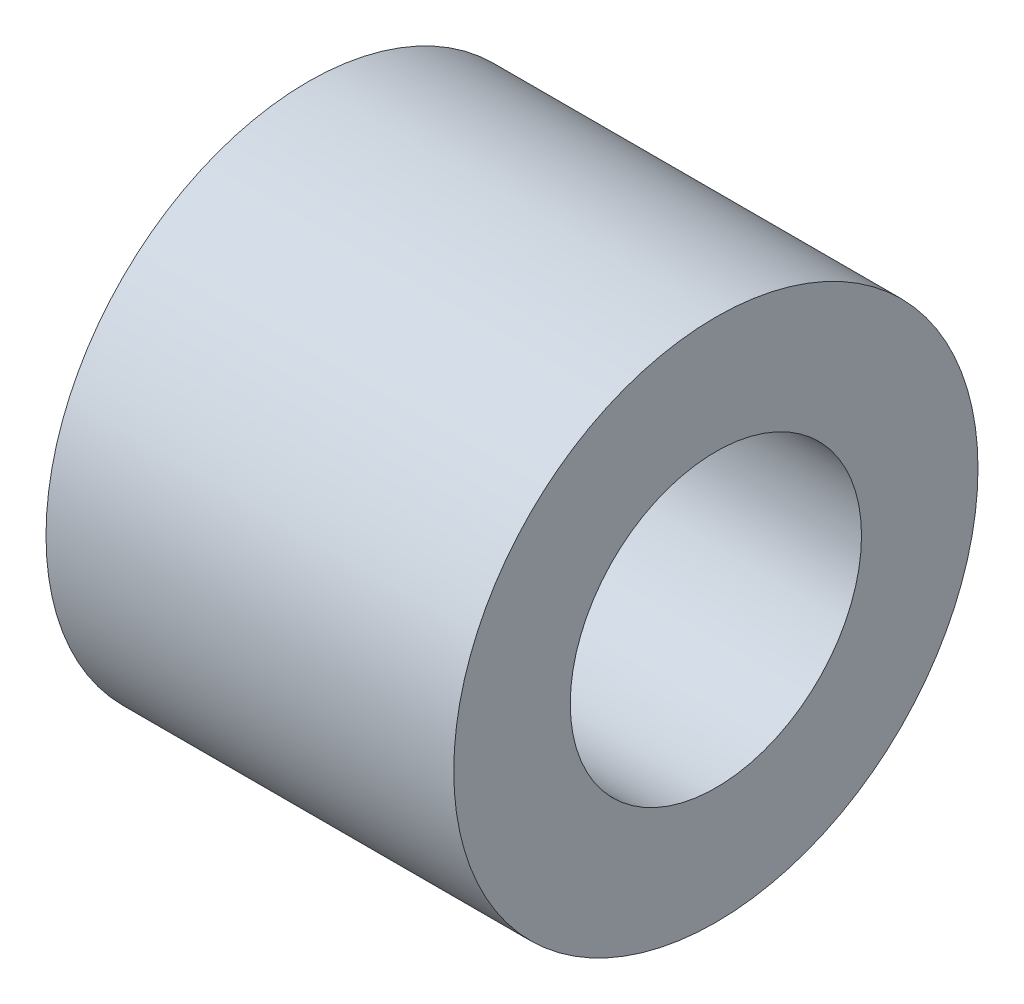
ISO-10303-21;
HEADER;
FILE_DESCRIPTION(('STEP AP214'),'2;1');
FILE_NAME('part.step','',(''),(''),'','','');
FILE_SCHEMA(('AUTOMOTIVE_DESIGN { 1 0 10303 214 1 1 1 1 }'));
ENDSEC;
DATA;
#1=APPLICATION_CONTEXT('core data for automotive mechanical design processes');
#2=APPLICATION_PROTOCOL_DEFINITION('international standard','automotive_design',2000,#1);
#3=PRODUCT_CONTEXT('',#1,'mechanical');
#4=PRODUCT('Part','Part','',(#3));
#5=PRODUCT_RELATED_PRODUCT_CATEGORY('part','',(#4));
#6=PRODUCT_DEFINITION_FORMATION('','',#4);
#7=PRODUCT_DEFINITION_CONTEXT('part definition',#1,'design');
#8=PRODUCT_DEFINITION('design','',#6,#7);
#9=PRODUCT_DEFINITION_SHAPE('','',#8);
#10=(LENGTH_UNIT() NAMED_UNIT(*) SI_UNIT(.MILLI.,.METRE.));
#11=(NAMED_UNIT(*) PLANE_ANGLE_UNIT() SI_UNIT($,.RADIAN.));
#12=(NAMED_UNIT(*) SI_UNIT($,.STERADIAN.) SOLID_ANGLE_UNIT());
#13=UNCERTAINTY_MEASURE_WITH_UNIT(LENGTH_MEASURE(1.E-05),#10,'distance_accuracy_value','');
#14=(GEOMETRIC_REPRESENTATION_CONTEXT(3) GLOBAL_UNCERTAINTY_ASSIGNED_CONTEXT((#13)) GLOBAL_UNIT_ASSIGNED_CONTEXT((#10,
#11,#12)) REPRESENTATION_CONTEXT('',''));
#15=CARTESIAN_POINT('',(0.,0.,0.));
#16=DIRECTION('',(0.,0.,1.));
#17=DIRECTION('',(1.,0.,0.));
#18=AXIS2_PLACEMENT_3D('',#15,#16,#17);
#19=CARTESIAN_POINT('',(-0.119999999999995,16.750000000001,-6.0999999999995));
#20=DIRECTION('',(1.,0.,0.));
#21=DIRECTION('',(0.,0.,-1.));
#22=AXIS2_PLACEMENT_3D('',#19,#20,#21);
#23=CYLINDRICAL_SURFACE('',#22,1.25000000000017);
#24=CARTESIAN_POINT('',(-0.119999999999995,16.750000000001,-6.0999999999995));
#25=DIRECTION('',(1.,0.,0.));
#26=DIRECTION('',(0.,0.,-1.));
#27=AXIS2_PLACEMENT_3D('',#24,#25,#26);
#28=CIRCLE('',#27,1.25000000000017);
#29=CARTESIAN_POINT('',(-0.119999999999995,16.750000000001,-7.34999999999967));
#30=VERTEX_POINT('',#29);
#31=EDGE_CURVE('E18',#30,#30,#28,.F.);
#32=ORIENTED_EDGE('',*,*,#31,.F.);
#33=EDGE_LOOP('',(#32));
#34=FACE_BOUND('',#33,.T.);
#35=CARTESIAN_POINT('',(-3.62,16.750000000001,-6.0999999999995));
#36=DIRECTION('',(1.,0.,0.));
#37=DIRECTION('',(0.,0.,-1.));
#38=AXIS2_PLACEMENT_3D('',#35,#36,#37);
#39=CIRCLE('',#38,1.25000000000017);
#40=CARTESIAN_POINT('',(-3.62,16.750000000001,-7.34999999999967));
#41=VERTEX_POINT('',#40);
#42=EDGE_CURVE('E27',#41,#41,#39,.T.);
#43=ORIENTED_EDGE('',*,*,#42,.F.);
#44=EDGE_LOOP('',(#43));
#45=FACE_BOUND('',#44,.T.);
#46=ADVANCED_FACE('F15',(#34,#45),#23,.F.);
#47=CARTESIAN_POINT('',(-0.119999999999995,19.199614713562,-8.57499999999951));
#48=DIRECTION('',(1.,0.,0.));
#49=DIRECTION('',(0.,0.,-1.));
#50=AXIS2_PLACEMENT_3D('',#47,#48,#49);
#51=PLANE('',#50);
#52=ORIENTED_EDGE('',*,*,#31,.T.);
#53=EDGE_LOOP('',(#52));
#54=FACE_BOUND('',#53,.T.);
#55=CARTESIAN_POINT('',(-0.119999999999995,16.750000000001,-6.1));
#56=DIRECTION('',(1.,0.,0.));
#57=DIRECTION('',(0.,0.,-1.));
#58=AXIS2_PLACEMENT_3D('',#55,#56,#57);
#59=CIRCLE('',#58,2.25000000000009);
#60=CARTESIAN_POINT('',(-0.119999999999995,16.750000000001,-8.35000000000009));
#61=VERTEX_POINT('',#60);
#62=EDGE_CURVE('E22',#61,#61,#59,.F.);
#63=ORIENTED_EDGE('',*,*,#62,.F.);
#64=EDGE_LOOP('',(#63));
#65=FACE_BOUND('',#64,.T.);
#66=ADVANCED_FACE('F35',(#54,#65),#51,.T.);
#67=CARTESIAN_POINT('',(-3.62,14.300385286439,-8.57499999999951));
#68=DIRECTION('',(-1.,0.,0.));
#69=DIRECTION('',(0.,0.,1.));
#70=AXIS2_PLACEMENT_3D('',#67,#68,#69);
#71=PLANE('',#70);
#72=ORIENTED_EDGE('',*,*,#42,.T.);
#73=EDGE_LOOP('',(#72));
#74=FACE_BOUND('',#73,.T.);
#75=CARTESIAN_POINT('',(-3.62,16.750000000001,-6.1));
#76=DIRECTION('',(1.,0.,0.));
#77=DIRECTION('',(0.,0.,-1.));
#78=AXIS2_PLACEMENT_3D('',#75,#76,#77);
#79=CIRCLE('',#78,2.25000000000009);
#80=CARTESIAN_POINT('',(-3.62,16.750000000001,-8.35000000000009));
#81=VERTEX_POINT('',#80);
#82=EDGE_CURVE('E10',#81,#81,#79,.T.);
#83=ORIENTED_EDGE('',*,*,#82,.F.);
#84=EDGE_LOOP('',(#83));
#85=FACE_BOUND('',#84,.T.);
#86=ADVANCED_FACE('F44',(#74,#85),#71,.T.);
#87=CARTESIAN_POINT('',(-0.119999999999995,16.750000000001,-6.1));
#88=DIRECTION('',(1.,0.,0.));
#89=DIRECTION('',(0.,0.,-1.));
#90=AXIS2_PLACEMENT_3D('',#87,#88,#89);
#91=CYLINDRICAL_SURFACE('',#90,2.25000000000009);
#92=ORIENTED_EDGE('',*,*,#62,.T.);
#93=EDGE_LOOP('',(#92));
#94=FACE_BOUND('',#93,.T.);
#95=ORIENTED_EDGE('',*,*,#82,.T.);
#96=EDGE_LOOP('',(#95));
#97=FACE_BOUND('',#96,.T.);
#98=ADVANCED_FACE('F45',(#94,#97),#91,.T.);
#99=CLOSED_SHELL('',(#46,#66,#86,#98));
#100=MANIFOLD_SOLID_BREP('B1',#99);
#101=ADVANCED_BREP_SHAPE_REPRESENTATION('',(#18,#100),#14);
#102=SHAPE_DEFINITION_REPRESENTATION(#9,#101);
ENDSEC;
END-ISO-10303-21;
